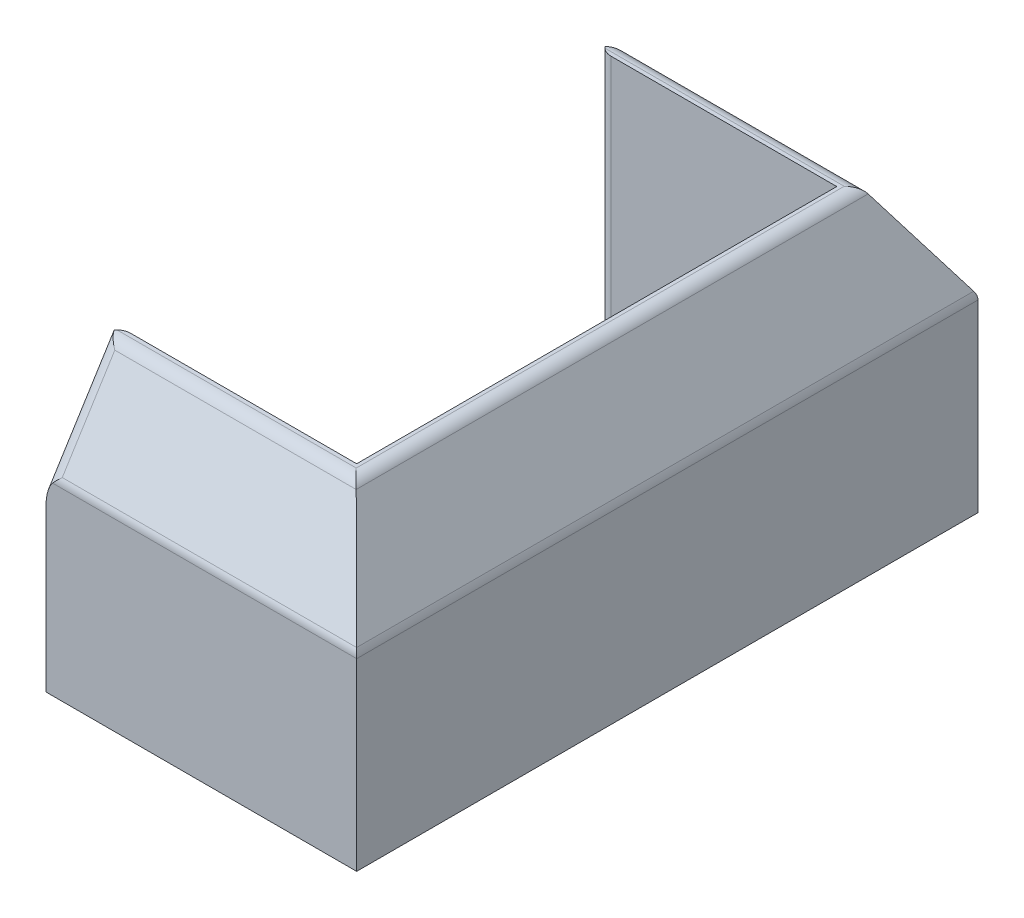
ISO-10303-21;
HEADER;
FILE_DESCRIPTION(('STEP AP214'),'2;1');
FILE_NAME('part.step','',(''),(''),'','','');
FILE_SCHEMA(('AUTOMOTIVE_DESIGN { 1 0 10303 214 1 1 1 1 }'));
ENDSEC;
DATA;
#1=APPLICATION_CONTEXT('core data for automotive mechanical design processes');
#2=APPLICATION_PROTOCOL_DEFINITION('international standard','automotive_design',2000,#1);
#3=PRODUCT_CONTEXT('',#1,'mechanical');
#4=PRODUCT('Part','Part','',(#3));
#5=PRODUCT_RELATED_PRODUCT_CATEGORY('part','',(#4));
#6=PRODUCT_DEFINITION_FORMATION('','',#4);
#7=PRODUCT_DEFINITION_CONTEXT('part definition',#1,'design');
#8=PRODUCT_DEFINITION('design','',#6,#7);
#9=PRODUCT_DEFINITION_SHAPE('','',#8);
#10=(LENGTH_UNIT() NAMED_UNIT(*) SI_UNIT(.MILLI.,.METRE.));
#11=(NAMED_UNIT(*) PLANE_ANGLE_UNIT() SI_UNIT($,.RADIAN.));
#12=(NAMED_UNIT(*) SI_UNIT($,.STERADIAN.) SOLID_ANGLE_UNIT());
#13=UNCERTAINTY_MEASURE_WITH_UNIT(LENGTH_MEASURE(1.E-05),#10,'distance_accuracy_value','');
#14=(GEOMETRIC_REPRESENTATION_CONTEXT(3) GLOBAL_UNCERTAINTY_ASSIGNED_CONTEXT((#13)) GLOBAL_UNIT_ASSIGNED_CONTEXT((#10,
#11,#12)) REPRESENTATION_CONTEXT('',''));
#15=CARTESIAN_POINT('',(0.,0.,0.));
#16=DIRECTION('',(0.,0.,1.));
#17=DIRECTION('',(1.,0.,0.));
#18=AXIS2_PLACEMENT_3D('',#15,#16,#17);
#19=CARTESIAN_POINT('',(-16.764,10.16,0.));
#20=DIRECTION('',(0.,0.,-1.));
#21=DIRECTION('',(-1.,0.,0.));
#22=AXIS2_PLACEMENT_3D('',#19,#20,#21);
#23=PLANE('',#22);
#24=DIRECTION('',(1.,0.,0.));
#25=VECTOR('',#24,1.);
#26=CARTESIAN_POINT('',(-16.764,9.94146127547458,0.));
#27=LINE('',#26,#25);
#28=CARTESIAN_POINT('',(0.,9.94146127547458,0.));
#29=VERTEX_POINT('',#28);
#30=CARTESIAN_POINT('',(-16.4058591922886,9.94146127547458,0.));
#31=VERTEX_POINT('',#30);
#32=EDGE_CURVE('E97',#29,#31,#27,.F.);
#33=ORIENTED_EDGE('',*,*,#32,.T.);
#34=CARTESIAN_POINT('',(-16.002,8.72226127547458,0.));
#35=DIRECTION('',(0.,0.,-1.));
#36=DIRECTION('',(0.,1.,0.));
#37=AXIS2_PLACEMENT_3D('',#34,#35,#36);
#38=ELLIPSE('',#37,1.43773872452543,0.762);
#39=CARTESIAN_POINT('',(-16.764,8.72226127547458,0.));
#40=VERTEX_POINT('',#39);
#41=EDGE_CURVE('E88',#31,#40,#38,.F.);
#42=ORIENTED_EDGE('',*,*,#41,.T.);
#43=DIRECTION('',(0.,-1.,0.));
#44=VECTOR('',#43,1.);
#45=CARTESIAN_POINT('',(-16.764,10.16,0.));
#46=LINE('',#45,#44);
#47=CARTESIAN_POINT('',(-16.764,0.,0.));
#48=VERTEX_POINT('',#47);
#49=EDGE_CURVE('E462',#40,#48,#46,.T.);
#50=ORIENTED_EDGE('',*,*,#49,.T.);
#51=DIRECTION('',(1.,0.,0.));
#52=VECTOR('',#51,1.);
#53=CARTESIAN_POINT('',(-16.764,0.,0.));
#54=LINE('',#53,#52);
#55=CARTESIAN_POINT('',(0.,0.,0.));
#56=VERTEX_POINT('',#55);
#57=EDGE_CURVE('E698',#48,#56,#54,.T.);
#58=ORIENTED_EDGE('',*,*,#57,.T.);
#59=DIRECTION('',(0.,-1.,0.));
#60=VECTOR('',#59,1.);
#61=CARTESIAN_POINT('',(0.,10.16,0.));
#62=LINE('',#61,#60);
#63=CARTESIAN_POINT('',(0.,9.93998127926982,0.));
#64=VERTEX_POINT('',#63);
#65=EDGE_CURVE('E269',#64,#56,#62,.T.);
#66=ORIENTED_EDGE('',*,*,#65,.F.);
#67=EDGE_CURVE('E267',#29,#64,#62,.T.);
#68=ORIENTED_EDGE('',*,*,#67,.F.);
#69=EDGE_LOOP('',(#33,#42,#50,#58,#66,#68));
#70=FACE_BOUND('',#69,.T.);
#71=ADVANCED_FACE('F77',(#70),#23,.F.);
#72=CARTESIAN_POINT('',(0.,10.16,0.));
#73=DIRECTION('',(-1.,0.,0.));
#74=DIRECTION('',(0.,0.,1.));
#75=AXIS2_PLACEMENT_3D('',#72,#73,#74);
#76=PLANE('',#75);
#77=DIRECTION('',(0.,-1.,0.));
#78=VECTOR('',#77,1.);
#79=CARTESIAN_POINT('',(0.,10.16,-33.528));
#80=LINE('',#79,#78);
#81=CARTESIAN_POINT('',(0.,9.93998127926982,-33.528));
#82=VERTEX_POINT('',#81);
#83=CARTESIAN_POINT('',(0.,0.,-33.528));
#84=VERTEX_POINT('',#83);
#85=EDGE_CURVE('E409',#82,#84,#80,.T.);
#86=ORIENTED_EDGE('',*,*,#85,.F.);
#87=DIRECTION('',(0.,0.,-1.));
#88=VECTOR('',#87,1.);
#89=CARTESIAN_POINT('',(0.,9.93998127926982,0.));
#90=LINE('',#89,#88);
#91=EDGE_CURVE('E12',#82,#64,#90,.F.);
#92=ORIENTED_EDGE('',*,*,#91,.T.);
#93=ORIENTED_EDGE('',*,*,#65,.T.);
#94=DIRECTION('',(0.,0.,-1.));
#95=VECTOR('',#94,1.);
#96=CARTESIAN_POINT('',(0.,0.,0.));
#97=LINE('',#96,#95);
#98=EDGE_CURVE('E718',#56,#84,#97,.T.);
#99=ORIENTED_EDGE('',*,*,#98,.T.);
#100=EDGE_LOOP('',(#86,#92,#93,#99));
#101=FACE_BOUND('',#100,.T.);
#102=ADVANCED_FACE('F344',(#101),#76,.F.);
#103=CARTESIAN_POINT('',(-3.81,10.16,-16.764));
#104=DIRECTION('',(1.,0.,0.));
#105=DIRECTION('',(0.,0.,-1.));
#106=AXIS2_PLACEMENT_3D('',#103,#104,#105);
#107=PLANE('',#106);
#108=DIRECTION('',(0.,-1.,0.));
#109=VECTOR('',#108,1.);
#110=CARTESIAN_POINT('',(-3.81,10.16,-11.43));
#111=LINE('',#110,#109);
#112=CARTESIAN_POINT('',(-3.81,2.54,-11.43));
#113=VERTEX_POINT('',#112);
#114=CARTESIAN_POINT('',(-3.81,0.,-11.43));
#115=VERTEX_POINT('',#114);
#116=EDGE_CURVE('E678',#113,#115,#111,.T.);
#117=ORIENTED_EDGE('',*,*,#116,.F.);
#118=DIRECTION('',(0.,0.,1.));
#119=VECTOR('',#118,1.);
#120=CARTESIAN_POINT('',(-3.81,2.54,-16.764));
#121=LINE('',#120,#119);
#122=CARTESIAN_POINT('',(-3.81,2.54,-3.81));
#123=VERTEX_POINT('',#122);
#124=EDGE_CURVE('E680',#113,#123,#121,.T.);
#125=ORIENTED_EDGE('',*,*,#124,.T.);
#126=DIRECTION('',(0.,-1.,0.));
#127=VECTOR('',#126,1.);
#128=CARTESIAN_POINT('',(-3.81,10.16,-3.81));
#129=LINE('',#128,#127);
#130=CARTESIAN_POINT('',(-3.81,15.24,-3.81));
#131=VERTEX_POINT('',#130);
#132=EDGE_CURVE('E734',#131,#123,#129,.T.);
#133=ORIENTED_EDGE('',*,*,#132,.F.);
#134=DIRECTION('',(0.,0.,1.));
#135=VECTOR('',#134,1.);
#136=CARTESIAN_POINT('',(-3.81,15.24,-16.764));
#137=LINE('',#136,#135);
#138=CARTESIAN_POINT('',(-3.81,15.24,-29.718));
#139=VERTEX_POINT('',#138);
#140=EDGE_CURVE('E124',#139,#131,#137,.T.);
#141=ORIENTED_EDGE('',*,*,#140,.F.);
#142=DIRECTION('',(0.,-1.,0.));
#143=VECTOR('',#142,1.);
#144=CARTESIAN_POINT('',(-3.81,10.16,-29.718));
#145=LINE('',#144,#143);
#146=CARTESIAN_POINT('',(-3.81,2.54,-29.718));
#147=VERTEX_POINT('',#146);
#148=EDGE_CURVE('E416',#139,#147,#145,.T.);
#149=ORIENTED_EDGE('',*,*,#148,.T.);
#150=DIRECTION('',(0.,0.,-1.));
#151=VECTOR('',#150,1.);
#152=CARTESIAN_POINT('',(-3.81,2.54,-16.764));
#153=LINE('',#152,#151);
#154=CARTESIAN_POINT('',(-3.81,2.54,-22.098));
#155=VERTEX_POINT('',#154);
#156=EDGE_CURVE('E617',#155,#147,#153,.T.);
#157=ORIENTED_EDGE('',*,*,#156,.F.);
#158=DIRECTION('',(0.,-1.,0.));
#159=VECTOR('',#158,1.);
#160=CARTESIAN_POINT('',(-3.81,10.16,-22.098));
#161=LINE('',#160,#159);
#162=CARTESIAN_POINT('',(-3.81,0.,-22.098));
#163=VERTEX_POINT('',#162);
#164=EDGE_CURVE('E623',#155,#163,#161,.T.);
#165=ORIENTED_EDGE('',*,*,#164,.T.);
#166=DIRECTION('',(0.,0.,1.));
#167=VECTOR('',#166,1.);
#168=CARTESIAN_POINT('',(-3.81,0.,-16.764));
#169=LINE('',#168,#167);
#170=EDGE_CURVE('E683',#163,#115,#169,.T.);
#171=ORIENTED_EDGE('',*,*,#170,.T.);
#172=EDGE_LOOP('',(#117,#125,#133,#141,#149,#157,#165,#171));
#173=FACE_BOUND('',#172,.T.);
#174=ADVANCED_FACE('F350',(#173),#107,.F.);
#175=CARTESIAN_POINT('',(-3.81,10.16,-3.81));
#176=DIRECTION('',(0.,0.,1.));
#177=DIRECTION('',(1.,0.,0.));
#178=AXIS2_PLACEMENT_3D('',#175,#176,#177);
#179=PLANE('',#178);
#180=DIRECTION('',(-1.,0.,0.));
#181=VECTOR('',#180,1.);
#182=CARTESIAN_POINT('',(-3.81,0.,-3.81));
#183=LINE('',#182,#181);
#184=CARTESIAN_POINT('',(-11.43,0.,-3.81));
#185=VERTEX_POINT('',#184);
#186=CARTESIAN_POINT('',(-16.002,0.,-3.81));
#187=VERTEX_POINT('',#186);
#188=EDGE_CURVE('E724',#185,#187,#183,.T.);
#189=ORIENTED_EDGE('',*,*,#188,.T.);
#190=DIRECTION('',(0.,-1.,0.));
#191=VECTOR('',#190,1.);
#192=CARTESIAN_POINT('',(-16.002,10.16,-3.81));
#193=LINE('',#192,#191);
#194=CARTESIAN_POINT('',(-16.002,15.24,-3.81));
#195=VERTEX_POINT('',#194);
#196=EDGE_CURVE('E550',#187,#195,#193,.F.);
#197=ORIENTED_EDGE('',*,*,#196,.T.);
#198=DIRECTION('',(-1.,0.,0.));
#199=VECTOR('',#198,1.);
#200=CARTESIAN_POINT('',(-3.81,15.24,-3.81));
#201=LINE('',#200,#199);
#202=EDGE_CURVE('E414',#131,#195,#201,.T.);
#203=ORIENTED_EDGE('',*,*,#202,.F.);
#204=ORIENTED_EDGE('',*,*,#132,.T.);
#205=DIRECTION('',(-1.,0.,0.));
#206=VECTOR('',#205,1.);
#207=CARTESIAN_POINT('',(-3.81,2.54,-3.81));
#208=LINE('',#207,#206);
#209=CARTESIAN_POINT('',(-11.43,2.54,-3.81));
#210=VERTEX_POINT('',#209);
#211=EDGE_CURVE('E274',#123,#210,#208,.T.);
#212=ORIENTED_EDGE('',*,*,#211,.T.);
#213=DIRECTION('',(0.,1.,0.));
#214=VECTOR('',#213,1.);
#215=CARTESIAN_POINT('',(-11.43,10.16,-3.81));
#216=LINE('',#215,#214);
#217=EDGE_CURVE('E689',#185,#210,#216,.T.);
#218=ORIENTED_EDGE('',*,*,#217,.F.);
#219=EDGE_LOOP('',(#189,#197,#203,#204,#212,#218));
#220=FACE_BOUND('',#219,.T.);
#221=ADVANCED_FACE('F665',(#220),#179,.F.);
#222=CARTESIAN_POINT('',(-16.764,10.16,-3.81));
#223=DIRECTION('',(1.,0.,0.));
#224=DIRECTION('',(0.,0.,-1.));
#225=AXIS2_PLACEMENT_3D('',#222,#223,#224);
#226=PLANE('',#225);
#227=DIRECTION('',(0.,0.847998304005088,-0.52999894000318));
#228=VECTOR('',#227,1.);
#229=CARTESIAN_POINT('',(-16.764,11.4685003582794,-1.716399426753));
#230=LINE('',#229,#228);
#231=CARTESIAN_POINT('',(-16.764,13.5990612754746,-3.048));
#232=VERTEX_POINT('',#231);
#233=EDGE_CURVE('E544',#40,#232,#230,.T.);
#234=ORIENTED_EDGE('',*,*,#233,.T.);
#235=DIRECTION('',(0.,-1.,0.));
#236=VECTOR('',#235,1.);
#237=CARTESIAN_POINT('',(-16.764,10.16,-3.048));
#238=LINE('',#237,#236);
#239=CARTESIAN_POINT('',(-16.764,0.,-3.048));
#240=VERTEX_POINT('',#239);
#241=EDGE_CURVE('E547',#232,#240,#238,.T.);
#242=ORIENTED_EDGE('',*,*,#241,.T.);
#243=DIRECTION('',(0.,0.,1.));
#244=VECTOR('',#243,1.);
#245=CARTESIAN_POINT('',(-16.764,0.,-3.81));
#246=LINE('',#245,#244);
#247=EDGE_CURVE('E728',#240,#48,#246,.T.);
#248=ORIENTED_EDGE('',*,*,#247,.T.);
#249=ORIENTED_EDGE('',*,*,#49,.F.);
#250=EDGE_LOOP('',(#234,#242,#248,#249));
#251=FACE_BOUND('',#250,.T.);
#252=ADVANCED_FACE('F656',(#251),#226,.F.);
#253=CARTESIAN_POINT('',(0.,0.,0.));
#254=DIRECTION('',(0.,1.,0.));
#255=DIRECTION('',(0.,0.,1.));
#256=AXIS2_PLACEMENT_3D('',#253,#254,#255);
#257=PLANE('',#256);
#258=DIRECTION('',(-1.,0.,0.));
#259=VECTOR('',#258,1.);
#260=CARTESIAN_POINT('',(0.,0.,-22.098));
#261=LINE('',#260,#259);
#262=CARTESIAN_POINT('',(-10.668,0.,-22.098));
#263=VERTEX_POINT('',#262);
#264=EDGE_CURVE('E634',#163,#263,#261,.T.);
#265=ORIENTED_EDGE('',*,*,#264,.T.);
#266=CARTESIAN_POINT('',(-10.668,0.,-22.86));
#267=DIRECTION('',(0.,1.,0.));
#268=DIRECTION('',(0.,0.,1.));
#269=AXIS2_PLACEMENT_3D('',#266,#267,#268);
#270=CIRCLE('',#269,0.762);
#271=CARTESIAN_POINT('',(-11.43,0.,-22.86));
#272=VERTEX_POINT('',#271);
#273=EDGE_CURVE('E480',#263,#272,#270,.F.);
#274=ORIENTED_EDGE('',*,*,#273,.T.);
#275=DIRECTION('',(0.,0.,-1.));
#276=VECTOR('',#275,1.);
#277=CARTESIAN_POINT('',(-11.43,0.,-33.528));
#278=LINE('',#277,#276);
#279=CARTESIAN_POINT('',(-11.43,0.,-29.718));
#280=VERTEX_POINT('',#279);
#281=EDGE_CURVE('E608',#272,#280,#278,.T.);
#282=ORIENTED_EDGE('',*,*,#281,.T.);
#283=DIRECTION('',(-1.,0.,0.));
#284=VECTOR('',#283,1.);
#285=CARTESIAN_POINT('',(-3.81,0.,-29.718));
#286=LINE('',#285,#284);
#287=CARTESIAN_POINT('',(-16.002,0.,-29.718));
#288=VERTEX_POINT('',#287);
#289=EDGE_CURVE('E598',#280,#288,#286,.T.);
#290=ORIENTED_EDGE('',*,*,#289,.T.);
#291=CARTESIAN_POINT('',(-16.002,0.,-30.48));
#292=DIRECTION('',(0.,1.,0.));
#293=DIRECTION('',(0.,0.,1.));
#294=AXIS2_PLACEMENT_3D('',#291,#292,#293);
#295=CIRCLE('',#294,0.762);
#296=CARTESIAN_POINT('',(-16.764,0.,-30.48));
#297=VERTEX_POINT('',#296);
#298=EDGE_CURVE('E477',#288,#297,#295,.F.);
#299=ORIENTED_EDGE('',*,*,#298,.T.);
#300=DIRECTION('',(0.,0.,-1.));
#301=VECTOR('',#300,1.);
#302=CARTESIAN_POINT('',(-16.764,0.,-29.718));
#303=LINE('',#302,#301);
#304=CARTESIAN_POINT('',(-16.764,0.,-33.528));
#305=VERTEX_POINT('',#304);
#306=EDGE_CURVE('E423',#297,#305,#303,.T.);
#307=ORIENTED_EDGE('',*,*,#306,.T.);
#308=DIRECTION('',(1.,0.,0.));
#309=VECTOR('',#308,1.);
#310=CARTESIAN_POINT('',(-16.764,0.,-33.528));
#311=LINE('',#310,#309);
#312=EDGE_CURVE('E611',#305,#84,#311,.T.);
#313=ORIENTED_EDGE('',*,*,#312,.T.);
#314=ORIENTED_EDGE('',*,*,#98,.F.);
#315=ORIENTED_EDGE('',*,*,#57,.F.);
#316=ORIENTED_EDGE('',*,*,#247,.F.);
#317=CARTESIAN_POINT('',(-16.002,0.,-3.048));
#318=DIRECTION('',(0.,1.,0.));
#319=DIRECTION('',(0.,0.,1.));
#320=AXIS2_PLACEMENT_3D('',#317,#318,#319);
#321=CIRCLE('',#320,0.762);
#322=EDGE_CURVE('E471',#240,#187,#321,.F.);
#323=ORIENTED_EDGE('',*,*,#322,.T.);
#324=ORIENTED_EDGE('',*,*,#188,.F.);
#325=DIRECTION('',(0.,0.,1.));
#326=VECTOR('',#325,1.);
#327=CARTESIAN_POINT('',(-11.43,0.,0.));
#328=LINE('',#327,#326);
#329=CARTESIAN_POINT('',(-11.43,0.,-10.668));
#330=VERTEX_POINT('',#329);
#331=EDGE_CURVE('E703',#330,#185,#328,.T.);
#332=ORIENTED_EDGE('',*,*,#331,.F.);
#333=CARTESIAN_POINT('',(-10.668,0.,-10.668));
#334=DIRECTION('',(0.,1.,0.));
#335=DIRECTION('',(0.,0.,1.));
#336=AXIS2_PLACEMENT_3D('',#333,#334,#335);
#337=CIRCLE('',#336,0.762);
#338=CARTESIAN_POINT('',(-10.668,0.,-11.43));
#339=VERTEX_POINT('',#338);
#340=EDGE_CURVE('E474',#330,#339,#337,.F.);
#341=ORIENTED_EDGE('',*,*,#340,.T.);
#342=DIRECTION('',(-1.,0.,0.));
#343=VECTOR('',#342,1.);
#344=CARTESIAN_POINT('',(0.,0.,-11.43));
#345=LINE('',#344,#343);
#346=EDGE_CURVE('E708',#115,#339,#345,.T.);
#347=ORIENTED_EDGE('',*,*,#346,.F.);
#348=ORIENTED_EDGE('',*,*,#170,.F.);
#349=EDGE_LOOP('',(#265,#274,#282,#290,#299,#307,#313,#314,#315,#316,#323,#324,#332,#341,#347,#348));
#350=FACE_BOUND('',#349,.T.);
#351=CARTESIAN_POINT('',(-7.874,0.,-7.874));
#352=DIRECTION('',(0.,1.,0.));
#353=DIRECTION('',(0.,0.,1.));
#354=AXIS2_PLACEMENT_3D('',#351,#352,#353);
#355=CIRCLE('',#354,2.);
#356=CARTESIAN_POINT('',(-7.874,0.,-5.874));
#357=VERTEX_POINT('',#356);
#358=EDGE_CURVE('E442',#357,#357,#355,.T.);
#359=ORIENTED_EDGE('',*,*,#358,.T.);
#360=EDGE_LOOP('',(#359));
#361=FACE_BOUND('',#360,.T.);
#362=CARTESIAN_POINT('',(-7.874,0.,-25.654));
#363=DIRECTION('',(0.,-1.,0.));
#364=DIRECTION('',(0.,0.,-1.));
#365=AXIS2_PLACEMENT_3D('',#362,#363,#364);
#366=CIRCLE('',#365,2.);
#367=CARTESIAN_POINT('',(-7.874,0.,-27.654));
#368=VERTEX_POINT('',#367);
#369=EDGE_CURVE('E575',#368,#368,#366,.T.);
#370=ORIENTED_EDGE('',*,*,#369,.F.);
#371=EDGE_LOOP('',(#370));
#372=FACE_BOUND('',#371,.T.);
#373=ADVANCED_FACE('F603',(#350,#361,#372),#257,.F.);
#374=CARTESIAN_POINT('',(0.,2.54,0.));
#375=DIRECTION('',(0.,1.,0.));
#376=DIRECTION('',(0.,0.,1.));
#377=AXIS2_PLACEMENT_3D('',#374,#375,#376);
#378=PLANE('',#377);
#379=CARTESIAN_POINT('',(-7.874,2.54,-7.874));
#380=DIRECTION('',(0.,1.,0.));
#381=DIRECTION('',(0.,0.,1.));
#382=AXIS2_PLACEMENT_3D('',#379,#380,#381);
#383=CIRCLE('',#382,2.);
#384=CARTESIAN_POINT('',(-7.874,2.54,-5.874));
#385=VERTEX_POINT('',#384);
#386=EDGE_CURVE('E431',#385,#385,#383,.T.);
#387=ORIENTED_EDGE('',*,*,#386,.F.);
#388=EDGE_LOOP('',(#387));
#389=FACE_BOUND('',#388,.T.);
#390=DIRECTION('',(-1.,0.,0.));
#391=VECTOR('',#390,1.);
#392=CARTESIAN_POINT('',(0.,2.54,-11.43));
#393=LINE('',#392,#391);
#394=CARTESIAN_POINT('',(-10.668,2.54,-11.43));
#395=VERTEX_POINT('',#394);
#396=EDGE_CURVE('E694',#113,#395,#393,.T.);
#397=ORIENTED_EDGE('',*,*,#396,.T.);
#398=CARTESIAN_POINT('',(-10.668,2.54,-10.668));
#399=DIRECTION('',(0.,1.,0.));
#400=DIRECTION('',(0.,0.,1.));
#401=AXIS2_PLACEMENT_3D('',#398,#399,#400);
#402=CIRCLE('',#401,0.762);
#403=CARTESIAN_POINT('',(-11.43,2.54,-10.668));
#404=VERTEX_POINT('',#403);
#405=EDGE_CURVE('E541',#395,#404,#402,.T.);
#406=ORIENTED_EDGE('',*,*,#405,.T.);
#407=DIRECTION('',(0.,0.,1.));
#408=VECTOR('',#407,1.);
#409=CARTESIAN_POINT('',(-11.43,2.54,0.));
#410=LINE('',#409,#408);
#411=EDGE_CURVE('E702',#404,#210,#410,.T.);
#412=ORIENTED_EDGE('',*,*,#411,.T.);
#413=ORIENTED_EDGE('',*,*,#211,.F.);
#414=ORIENTED_EDGE('',*,*,#124,.F.);
#415=EDGE_LOOP('',(#397,#406,#412,#413,#414));
#416=FACE_BOUND('',#415,.T.);
#417=ADVANCED_FACE('F655',(#389,#416),#378,.T.);
#418=CARTESIAN_POINT('',(0.,2.54,-11.43));
#419=DIRECTION('',(0.,0.,1.));
#420=DIRECTION('',(1.,0.,0.));
#421=AXIS2_PLACEMENT_3D('',#418,#419,#420);
#422=PLANE('',#421);
#423=ORIENTED_EDGE('',*,*,#346,.T.);
#424=DIRECTION('',(0.,-1.,0.));
#425=VECTOR('',#424,1.);
#426=CARTESIAN_POINT('',(-10.668,2.54,-11.43));
#427=LINE('',#426,#425);
#428=EDGE_CURVE('E538',#339,#395,#427,.F.);
#429=ORIENTED_EDGE('',*,*,#428,.T.);
#430=ORIENTED_EDGE('',*,*,#396,.F.);
#431=ORIENTED_EDGE('',*,*,#116,.T.);
#432=EDGE_LOOP('',(#423,#429,#430,#431));
#433=FACE_BOUND('',#432,.T.);
#434=ADVANCED_FACE('F662',(#433),#422,.F.);
#435=CARTESIAN_POINT('',(-11.43,2.54,0.));
#436=DIRECTION('',(1.,0.,0.));
#437=DIRECTION('',(0.,0.,-1.));
#438=AXIS2_PLACEMENT_3D('',#435,#436,#437);
#439=PLANE('',#438);
#440=ORIENTED_EDGE('',*,*,#411,.F.);
#441=DIRECTION('',(0.,-1.,0.));
#442=VECTOR('',#441,1.);
#443=CARTESIAN_POINT('',(-11.43,2.54,-10.668));
#444=LINE('',#443,#442);
#445=EDGE_CURVE('E532',#404,#330,#444,.T.);
#446=ORIENTED_EDGE('',*,*,#445,.T.);
#447=ORIENTED_EDGE('',*,*,#331,.T.);
#448=ORIENTED_EDGE('',*,*,#217,.T.);
#449=EDGE_LOOP('',(#440,#446,#447,#448));
#450=FACE_BOUND('',#449,.T.);
#451=ADVANCED_FACE('F769',(#450),#439,.F.);
#452=CARTESIAN_POINT('',(-7.874,2.54,-7.874));
#453=DIRECTION('',(0.,-1.,0.));
#454=DIRECTION('',(0.,0.,-1.));
#455=AXIS2_PLACEMENT_3D('',#452,#453,#454);
#456=CYLINDRICAL_SURFACE('',#455,2.);
#457=ORIENTED_EDGE('',*,*,#386,.T.);
#458=EDGE_LOOP('',(#457));
#459=FACE_BOUND('',#458,.T.);
#460=ORIENTED_EDGE('',*,*,#358,.F.);
#461=EDGE_LOOP('',(#460));
#462=FACE_BOUND('',#461,.T.);
#463=ADVANCED_FACE('F792',(#459,#462),#456,.F.);
#464=CARTESIAN_POINT('',(0.,15.24,0.));
#465=DIRECTION('',(0.,-1.,0.));
#466=DIRECTION('',(0.,0.,-1.));
#467=AXIS2_PLACEMENT_3D('',#464,#465,#466);
#468=PLANE('',#467);
#469=DIRECTION('',(1.,0.,0.));
#470=VECTOR('',#469,1.);
#471=CARTESIAN_POINT('',(0.,15.24,-29.9306632971716));
#472=LINE('',#471,#470);
#473=CARTESIAN_POINT('',(-3.62095179406001,15.24,-29.9306632971716));
#474=VERTEX_POINT('',#473);
#475=CARTESIAN_POINT('',(-16.5300844505623,15.24,-29.9306632971716));
#476=VERTEX_POINT('',#475);
#477=EDGE_CURVE('E521',#474,#476,#472,.F.);
#478=ORIENTED_EDGE('',*,*,#477,.T.);
#479=CARTESIAN_POINT('',(-16.002,15.24,-30.48));
#480=DIRECTION('',(0.,-1.,0.));
#481=DIRECTION('',(0.,0.,-1.));
#482=AXIS2_PLACEMENT_3D('',#479,#480,#481);
#483=CIRCLE('',#482,0.762);
#484=CARTESIAN_POINT('',(-16.002,15.24,-29.718));
#485=VERTEX_POINT('',#484);
#486=EDGE_CURVE('E444',#476,#485,#483,.F.);
#487=ORIENTED_EDGE('',*,*,#486,.T.);
#488=DIRECTION('',(1.,0.,0.));
#489=VECTOR('',#488,1.);
#490=CARTESIAN_POINT('',(-3.81,15.24,-29.718));
#491=LINE('',#490,#489);
#492=EDGE_CURVE('E424',#139,#485,#491,.F.);
#493=ORIENTED_EDGE('',*,*,#492,.F.);
#494=ORIENTED_EDGE('',*,*,#140,.T.);
#495=ORIENTED_EDGE('',*,*,#202,.T.);
#496=CARTESIAN_POINT('',(-16.002,15.24,-3.048));
#497=DIRECTION('',(0.,-1.,0.));
#498=DIRECTION('',(0.,0.,-1.));
#499=AXIS2_PLACEMENT_3D('',#496,#497,#498);
#500=CIRCLE('',#499,0.762);
#501=CARTESIAN_POINT('',(-16.5300844505623,15.24,-3.59733670282839));
#502=VERTEX_POINT('',#501);
#503=EDGE_CURVE('E519',#195,#502,#500,.F.);
#504=ORIENTED_EDGE('',*,*,#503,.T.);
#505=DIRECTION('',(1.,0.,0.));
#506=VECTOR('',#505,1.);
#507=CARTESIAN_POINT('',(0.,15.24,-3.59733670282839));
#508=LINE('',#507,#506);
#509=CARTESIAN_POINT('',(-3.62095179406001,15.24,-3.59733670282839));
#510=VERTEX_POINT('',#509);
#511=EDGE_CURVE('E513',#502,#510,#508,.T.);
#512=ORIENTED_EDGE('',*,*,#511,.T.);
#513=DIRECTION('',(0.,0.,-1.));
#514=VECTOR('',#513,1.);
#515=CARTESIAN_POINT('',(-3.62095179406001,15.24,0.));
#516=LINE('',#515,#514);
#517=EDGE_CURVE('E516',#510,#474,#516,.T.);
#518=ORIENTED_EDGE('',*,*,#517,.T.);
#519=EDGE_LOOP('',(#478,#487,#493,#494,#495,#504,#512,#518));
#520=FACE_BOUND('',#519,.T.);
#521=ADVANCED_FACE('F775',(#520),#468,.F.);
#522=CARTESIAN_POINT('',(0.,2.85393258426967,4.56629213483146));
#523=DIRECTION('',(0.,-0.52999894000318,-0.847998304005088));
#524=DIRECTION('',(0.,0.847998304005088,-0.52999894000318));
#525=AXIS2_PLACEMENT_3D('',#522,#523,#524);
#526=PLANE('',#525);
#527=DIRECTION('',(-0.471209987801044,0.747952361588959,-0.467470225993099));
#528=VECTOR('',#527,1.);
#529=CARTESIAN_POINT('',(0.,10.16,0.));
#530=LINE('',#529,#528);
#531=CARTESIAN_POINT('',(-0.117278263254339,10.3461559734196,-0.116347483387241));
#532=VERTEX_POINT('',#531);
#533=CARTESIAN_POINT('',(-2.97477129113793,14.8818591922824,-2.95116199517651));
#534=VERTEX_POINT('',#533);
#535=EDGE_CURVE('E443',#532,#534,#530,.T.);
#536=ORIENTED_EDGE('',*,*,#535,.T.);
#537=DIRECTION('',(1.,0.,0.));
#538=VECTOR('',#537,1.);
#539=CARTESIAN_POINT('',(0.,14.8818591922824,-2.95116199517651));
#540=LINE('',#539,#538);
#541=CARTESIAN_POINT('',(-16.002,14.8818591922824,-2.95116199517651));
#542=VERTEX_POINT('',#541);
#543=EDGE_CURVE('E286',#534,#542,#540,.F.);
#544=ORIENTED_EDGE('',*,*,#543,.T.);
#545=DIRECTION('',(0.,0.847998304005088,-0.52999894000318));
#546=VECTOR('',#545,1.);
#547=CARTESIAN_POINT('',(-16.002,2.85393258426967,4.56629213483146));
#548=LINE('',#547,#546);
#549=CARTESIAN_POINT('',(-16.002,10.345320467757,-0.115825292348123));
#550=VERTEX_POINT('',#549);
#551=EDGE_CURVE('E556',#542,#550,#548,.F.);
#552=ORIENTED_EDGE('',*,*,#551,.T.);
#553=DIRECTION('',(1.,0.,0.));
#554=VECTOR('',#553,1.);
#555=CARTESIAN_POINT('',(0.,10.345320467757,-0.115825292348123));
#556=LINE('',#555,#554);
#557=CARTESIAN_POINT('',(-0.116751894686909,10.345320467757,-0.115825292348124));
#558=VERTEX_POINT('',#557);
#559=EDGE_CURVE('E553',#550,#558,#556,.T.);
#560=ORIENTED_EDGE('',*,*,#559,.T.);
#561=EDGE_CURVE('E291',#558,#532,#530,.T.);
#562=ORIENTED_EDGE('',*,*,#561,.T.);
#563=EDGE_LOOP('',(#536,#544,#552,#560,#562));
#564=FACE_BOUND('',#563,.T.);
#565=ADVANCED_FACE('F779',(#564),#526,.F.);
#566=CARTESIAN_POINT('',(4.58214618082898,2.88675209392226,0.));
#567=DIRECTION('',(-0.846091518038927,-0.533037656364524,0.));
#568=DIRECTION('',(0.533037656364524,-0.846091518038927,0.));
#569=AXIS2_PLACEMENT_3D('',#566,#567,#568);
#570=PLANE('',#569);
#571=DIRECTION('',(-0.471209987801044,0.747952361588959,0.467470225993099));
#572=VECTOR('',#571,1.);
#573=CARTESIAN_POINT('',(0.,10.16,-33.528));
#574=LINE('',#573,#572);
#575=CARTESIAN_POINT('',(-2.97477129113792,14.8818591922824,-30.5768380048235));
#576=VERTEX_POINT('',#575);
#577=CARTESIAN_POINT('',(-2.97623005731435,14.8841746941498,-30.5753908161564));
#578=VERTEX_POINT('',#577);
#579=EDGE_CURVE('E428',#576,#578,#574,.T.);
#580=ORIENTED_EDGE('',*,*,#579,.T.);
#581=DIRECTION('',(0.,0.,-1.));
#582=VECTOR('',#581,1.);
#583=CARTESIAN_POINT('',(-2.97623005731435,14.8841746941498,0.));
#584=LINE('',#583,#582);
#585=CARTESIAN_POINT('',(-2.97623005731435,14.8841746941498,-2.9526091838436));
#586=VERTEX_POINT('',#585);
#587=EDGE_CURVE('E527',#578,#586,#584,.F.);
#588=ORIENTED_EDGE('',*,*,#587,.T.);
#589=EDGE_CURVE('E436',#534,#586,#530,.T.);
#590=ORIENTED_EDGE('',*,*,#589,.F.);
#591=ORIENTED_EDGE('',*,*,#535,.F.);
#592=DIRECTION('',(0.,0.,-1.));
#593=VECTOR('',#592,1.);
#594=CARTESIAN_POINT('',(-0.117278263254339,10.3461559734196,0.));
#595=LINE('',#594,#593);
#596=CARTESIAN_POINT('',(-0.117278263254339,10.3461559734196,-33.4116525166128));
#597=VERTEX_POINT('',#596);
#598=EDGE_CURVE('E525',#532,#597,#595,.T.);
#599=ORIENTED_EDGE('',*,*,#598,.T.);
#600=EDGE_CURVE('E573',#597,#576,#574,.T.);
#601=ORIENTED_EDGE('',*,*,#600,.T.);
#602=EDGE_LOOP('',(#580,#588,#590,#591,#599,#601));
#603=FACE_BOUND('',#602,.T.);
#604=ADVANCED_FACE('F586',(#603),#570,.F.);
#605=CARTESIAN_POINT('',(-16.764,10.16,-33.528));
#606=DIRECTION('',(0.,0.,1.));
#607=DIRECTION('',(-1.,0.,0.));
#608=AXIS2_PLACEMENT_3D('',#605,#606,#607);
#609=PLANE('',#608);
#610=DIRECTION('',(0.,-1.,0.));
#611=VECTOR('',#610,1.);
#612=CARTESIAN_POINT('',(-16.764,10.16,-33.528));
#613=LINE('',#612,#611);
#614=CARTESIAN_POINT('',(-16.764,8.72226127547458,-33.528));
#615=VERTEX_POINT('',#614);
#616=EDGE_CURVE('E419',#615,#305,#613,.T.);
#617=ORIENTED_EDGE('',*,*,#616,.F.);
#618=CARTESIAN_POINT('',(-16.002,8.72226127547459,-33.528));
#619=DIRECTION('',(0.,0.,1.));
#620=DIRECTION('',(0.,1.,0.));
#621=AXIS2_PLACEMENT_3D('',#618,#619,#620);
#622=ELLIPSE('',#621,1.43773872452543,0.762);
#623=CARTESIAN_POINT('',(-16.4058591922886,9.94146127547459,-33.528));
#624=VERTEX_POINT('',#623);
#625=EDGE_CURVE('E507',#615,#624,#622,.F.);
#626=ORIENTED_EDGE('',*,*,#625,.T.);
#627=DIRECTION('',(1.,0.,0.));
#628=VECTOR('',#627,1.);
#629=CARTESIAN_POINT('',(-16.764,9.94146127547459,-33.528));
#630=LINE('',#629,#628);
#631=CARTESIAN_POINT('',(0.,9.94146127547458,-33.528));
#632=VERTEX_POINT('',#631);
#633=EDGE_CURVE('E397',#624,#632,#630,.T.);
#634=ORIENTED_EDGE('',*,*,#633,.T.);
#635=EDGE_CURVE('E404',#632,#82,#80,.T.);
#636=ORIENTED_EDGE('',*,*,#635,.T.);
#637=ORIENTED_EDGE('',*,*,#85,.T.);
#638=ORIENTED_EDGE('',*,*,#312,.F.);
#639=EDGE_LOOP('',(#617,#626,#634,#636,#637,#638));
#640=FACE_BOUND('',#639,.T.);
#641=ADVANCED_FACE('F747',(#640),#609,.F.);
#642=CARTESIAN_POINT('',(-3.81,10.16,-29.718));
#643=DIRECTION('',(0.,0.,-1.));
#644=DIRECTION('',(1.,0.,0.));
#645=AXIS2_PLACEMENT_3D('',#642,#643,#644);
#646=PLANE('',#645);
#647=ORIENTED_EDGE('',*,*,#492,.T.);
#648=DIRECTION('',(0.,-1.,0.));
#649=VECTOR('',#648,1.);
#650=CARTESIAN_POINT('',(-16.002,10.16,-29.718));
#651=LINE('',#650,#649);
#652=EDGE_CURVE('E510',#485,#288,#651,.T.);
#653=ORIENTED_EDGE('',*,*,#652,.T.);
#654=ORIENTED_EDGE('',*,*,#289,.F.);
#655=DIRECTION('',(0.,1.,0.));
#656=VECTOR('',#655,1.);
#657=CARTESIAN_POINT('',(-11.43,10.16,-29.718));
#658=LINE('',#657,#656);
#659=CARTESIAN_POINT('',(-11.43,2.54,-29.718));
#660=VERTEX_POINT('',#659);
#661=EDGE_CURVE('E627',#280,#660,#658,.T.);
#662=ORIENTED_EDGE('',*,*,#661,.T.);
#663=DIRECTION('',(-1.,0.,0.));
#664=VECTOR('',#663,1.);
#665=CARTESIAN_POINT('',(-3.81,2.54,-29.718));
#666=LINE('',#665,#664);
#667=EDGE_CURVE('E408',#147,#660,#666,.T.);
#668=ORIENTED_EDGE('',*,*,#667,.F.);
#669=ORIENTED_EDGE('',*,*,#148,.F.);
#670=EDGE_LOOP('',(#647,#653,#654,#662,#668,#669));
#671=FACE_BOUND('',#670,.T.);
#672=ADVANCED_FACE('F595',(#671),#646,.F.);
#673=CARTESIAN_POINT('',(-16.764,10.16,-29.718));
#674=DIRECTION('',(1.,0.,0.));
#675=DIRECTION('',(0.,0.,1.));
#676=AXIS2_PLACEMENT_3D('',#673,#674,#675);
#677=PLANE('',#676);
#678=DIRECTION('',(0.,-1.,0.));
#679=VECTOR('',#678,1.);
#680=CARTESIAN_POINT('',(-16.764,10.16,-30.48));
#681=LINE('',#680,#679);
#682=CARTESIAN_POINT('',(-16.764,13.5990612754746,-30.48));
#683=VERTEX_POINT('',#682);
#684=EDGE_CURVE('E498',#297,#683,#681,.F.);
#685=ORIENTED_EDGE('',*,*,#684,.T.);
#686=DIRECTION('',(0.,0.847998304005088,0.52999894000318));
#687=VECTOR('',#686,1.);
#688=CARTESIAN_POINT('',(-16.764,11.4685003582794,-31.811600573247));
#689=LINE('',#688,#687);
#690=EDGE_CURVE('E501',#683,#615,#689,.F.);
#691=ORIENTED_EDGE('',*,*,#690,.T.);
#692=ORIENTED_EDGE('',*,*,#616,.T.);
#693=ORIENTED_EDGE('',*,*,#306,.F.);
#694=EDGE_LOOP('',(#685,#691,#692,#693));
#695=FACE_BOUND('',#694,.T.);
#696=ADVANCED_FACE('F870',(#695),#677,.F.);
#697=CARTESIAN_POINT('',(0.,2.54,-33.528));
#698=DIRECTION('',(0.,1.,0.));
#699=DIRECTION('',(0.,0.,-1.));
#700=AXIS2_PLACEMENT_3D('',#697,#698,#699);
#701=PLANE('',#700);
#702=CARTESIAN_POINT('',(-7.874,2.54,-25.654));
#703=DIRECTION('',(0.,-1.,0.));
#704=DIRECTION('',(0.,0.,-1.));
#705=AXIS2_PLACEMENT_3D('',#702,#703,#704);
#706=CIRCLE('',#705,2.);
#707=CARTESIAN_POINT('',(-7.874,2.54,-27.654));
#708=VERTEX_POINT('',#707);
#709=EDGE_CURVE('E580',#708,#708,#706,.T.);
#710=ORIENTED_EDGE('',*,*,#709,.T.);
#711=EDGE_LOOP('',(#710));
#712=FACE_BOUND('',#711,.T.);
#713=DIRECTION('',(0.,0.,-1.));
#714=VECTOR('',#713,1.);
#715=CARTESIAN_POINT('',(-11.43,2.54,-33.528));
#716=LINE('',#715,#714);
#717=CARTESIAN_POINT('',(-11.43,2.54,-22.86));
#718=VERTEX_POINT('',#717);
#719=EDGE_CURVE('E630',#718,#660,#716,.T.);
#720=ORIENTED_EDGE('',*,*,#719,.F.);
#721=CARTESIAN_POINT('',(-10.668,2.54,-22.86));
#722=DIRECTION('',(0.,1.,0.));
#723=DIRECTION('',(0.,0.,1.));
#724=AXIS2_PLACEMENT_3D('',#721,#722,#723);
#725=CIRCLE('',#724,0.762);
#726=CARTESIAN_POINT('',(-10.668,2.54,-22.098));
#727=VERTEX_POINT('',#726);
#728=EDGE_CURVE('E486',#718,#727,#725,.T.);
#729=ORIENTED_EDGE('',*,*,#728,.T.);
#730=DIRECTION('',(-1.,0.,0.));
#731=VECTOR('',#730,1.);
#732=CARTESIAN_POINT('',(0.,2.54,-22.098));
#733=LINE('',#732,#731);
#734=EDGE_CURVE('E633',#155,#727,#733,.T.);
#735=ORIENTED_EDGE('',*,*,#734,.F.);
#736=ORIENTED_EDGE('',*,*,#156,.T.);
#737=ORIENTED_EDGE('',*,*,#667,.T.);
#738=EDGE_LOOP('',(#720,#729,#735,#736,#737));
#739=FACE_BOUND('',#738,.T.);
#740=ADVANCED_FACE('F645',(#712,#739),#701,.T.);
#741=CARTESIAN_POINT('',(0.,2.54,-22.098));
#742=DIRECTION('',(0.,0.,-1.));
#743=DIRECTION('',(1.,0.,0.));
#744=AXIS2_PLACEMENT_3D('',#741,#742,#743);
#745=PLANE('',#744);
#746=ORIENTED_EDGE('',*,*,#734,.T.);
#747=DIRECTION('',(0.,-1.,0.));
#748=VECTOR('',#747,1.);
#749=CARTESIAN_POINT('',(-10.668,2.54,-22.098));
#750=LINE('',#749,#748);
#751=EDGE_CURVE('E467',#727,#263,#750,.T.);
#752=ORIENTED_EDGE('',*,*,#751,.T.);
#753=ORIENTED_EDGE('',*,*,#264,.F.);
#754=ORIENTED_EDGE('',*,*,#164,.F.);
#755=EDGE_LOOP('',(#746,#752,#753,#754));
#756=FACE_BOUND('',#755,.T.);
#757=ADVANCED_FACE('F763',(#756),#745,.F.);
#758=CARTESIAN_POINT('',(-11.43,2.54,-33.528));
#759=DIRECTION('',(1.,0.,0.));
#760=DIRECTION('',(0.,0.,1.));
#761=AXIS2_PLACEMENT_3D('',#758,#759,#760);
#762=PLANE('',#761);
#763=ORIENTED_EDGE('',*,*,#281,.F.);
#764=DIRECTION('',(0.,-1.,0.));
#765=VECTOR('',#764,1.);
#766=CARTESIAN_POINT('',(-11.43,2.54,-22.86));
#767=LINE('',#766,#765);
#768=EDGE_CURVE('E483',#272,#718,#767,.F.);
#769=ORIENTED_EDGE('',*,*,#768,.T.);
#770=ORIENTED_EDGE('',*,*,#719,.T.);
#771=ORIENTED_EDGE('',*,*,#661,.F.);
#772=EDGE_LOOP('',(#763,#769,#770,#771));
#773=FACE_BOUND('',#772,.T.);
#774=ADVANCED_FACE('F650',(#773),#762,.F.);
#775=CARTESIAN_POINT('',(-7.874,2.54,-25.654));
#776=DIRECTION('',(0.,-1.,0.));
#777=DIRECTION('',(0.,0.,1.));
#778=AXIS2_PLACEMENT_3D('',#775,#776,#777);
#779=CYLINDRICAL_SURFACE('',#778,2.);
#780=ORIENTED_EDGE('',*,*,#709,.F.);
#781=EDGE_LOOP('',(#780));
#782=FACE_BOUND('',#781,.T.);
#783=ORIENTED_EDGE('',*,*,#369,.T.);
#784=EDGE_LOOP('',(#783));
#785=FACE_BOUND('',#784,.T.);
#786=ADVANCED_FACE('F648',(#782,#785),#779,.F.);
#787=CARTESIAN_POINT('',(0.,2.85393258426967,-38.0942921348315));
#788=DIRECTION('',(0.,-0.52999894000318,0.847998304005088));
#789=DIRECTION('',(0.,0.847998304005088,0.52999894000318));
#790=AXIS2_PLACEMENT_3D('',#787,#788,#789);
#791=PLANE('',#790);
#792=CARTESIAN_POINT('',(-0.116751894686913,10.345320467757,-33.4121747076519));
#793=VERTEX_POINT('',#792);
#794=EDGE_CURVE('E402',#793,#597,#574,.T.);
#795=ORIENTED_EDGE('',*,*,#794,.F.);
#796=DIRECTION('',(1.,0.,0.));
#797=VECTOR('',#796,1.);
#798=CARTESIAN_POINT('',(0.,10.345320467757,-33.4121747076519));
#799=LINE('',#798,#797);
#800=CARTESIAN_POINT('',(-16.002,10.345320467757,-33.4121747076519));
#801=VERTEX_POINT('',#800);
#802=EDGE_CURVE('E399',#793,#801,#799,.F.);
#803=ORIENTED_EDGE('',*,*,#802,.T.);
#804=DIRECTION('',(0.,0.847998304005088,0.52999894000318));
#805=VECTOR('',#804,1.);
#806=CARTESIAN_POINT('',(-16.002,2.85393258426967,-38.0942921348315));
#807=LINE('',#806,#805);
#808=CARTESIAN_POINT('',(-16.002,14.8818591922824,-30.5768380048235));
#809=VERTEX_POINT('',#808);
#810=EDGE_CURVE('E492',#801,#809,#807,.T.);
#811=ORIENTED_EDGE('',*,*,#810,.T.);
#812=DIRECTION('',(1.,0.,0.));
#813=VECTOR('',#812,1.);
#814=CARTESIAN_POINT('',(0.,14.8818591922824,-30.5768380048235));
#815=LINE('',#814,#813);
#816=EDGE_CURVE('E489',#809,#576,#815,.T.);
#817=ORIENTED_EDGE('',*,*,#816,.T.);
#818=ORIENTED_EDGE('',*,*,#600,.F.);
#819=EDGE_LOOP('',(#795,#803,#811,#817,#818));
#820=FACE_BOUND('',#819,.T.);
#821=ADVANCED_FACE('F340',(#820),#791,.F.);
#822=CARTESIAN_POINT('',(-10.668,2.54,-22.86));
#823=DIRECTION('',(0.,-1.,0.));
#824=DIRECTION('',(0.,0.,-1.));
#825=AXIS2_PLACEMENT_3D('',#822,#823,#824);
#826=CYLINDRICAL_SURFACE('',#825,0.762);
#827=ORIENTED_EDGE('',*,*,#728,.F.);
#828=ORIENTED_EDGE('',*,*,#768,.F.);
#829=ORIENTED_EDGE('',*,*,#273,.F.);
#830=ORIENTED_EDGE('',*,*,#751,.F.);
#831=EDGE_LOOP('',(#827,#828,#829,#830));
#832=FACE_BOUND('',#831,.T.);
#833=ADVANCED_FACE('F335',(#832),#826,.T.);
#834=CARTESIAN_POINT('',(-16.002,11.4685003582794,-1.716399426753));
#835=DIRECTION('',(0.,0.847998304005088,-0.52999894000318));
#836=DIRECTION('',(0.,0.52999894000318,0.847998304005088));
#837=AXIS2_PLACEMENT_3D('',#834,#835,#836);
#838=CYLINDRICAL_SURFACE('',#837,0.762);
#839=CARTESIAN_POINT('',(-16.002,13.5990612754746,-3.048));
#840=DIRECTION('',(0.,-0.27568251304255,-0.961248746164355));
#841=DIRECTION('',(0.,-0.961248746164355,0.275682513042551));
#842=AXIS2_PLACEMENT_3D('',#839,#840,#841);
#843=ELLIPSE('',#842,2.76404909252401,0.762);
#844=CARTESIAN_POINT('',(-16.6022488777699,15.2357965711703,-3.51740950643975));
#845=VERTEX_POINT('',#844);
#846=EDGE_CURVE('E81',#232,#845,#843,.T.);
#847=ORIENTED_EDGE('',*,*,#846,.F.);
#848=ORIENTED_EDGE('',*,*,#233,.F.);
#849=ORIENTED_EDGE('',*,*,#41,.F.);
#850=CARTESIAN_POINT('',(-16.002,9.94146127547458,-0.762));
#851=DIRECTION('',(0.707106781186547,-0.599625351196689,0.374765844497931));
#852=DIRECTION('',(0.707106781186548,0.599625351196689,-0.374765844497931));
#853=AXIS2_PLACEMENT_3D('',#850,#851,#852);
#854=ELLIPSE('',#853,1.0776307345283,0.762);
#855=EDGE_CURVE('E284',#550,#31,#854,.T.);
#856=ORIENTED_EDGE('',*,*,#855,.F.);
#857=ORIENTED_EDGE('',*,*,#551,.F.);
#858=CARTESIAN_POINT('',(-16.002,14.478,-3.59733670282839));
#859=DIRECTION('',(0.707106781186547,0.599625351196689,-0.374765844497931));
#860=DIRECTION('',(0.707106781186547,-0.599625351196689,0.374765844497931));
#861=AXIS2_PLACEMENT_3D('',#858,#859,#860);
#862=ELLIPSE('',#861,1.0776307345283,0.762);
#863=EDGE_CURVE('E299',#845,#542,#862,.T.);
#864=ORIENTED_EDGE('',*,*,#863,.F.);
#865=EDGE_LOOP('',(#847,#848,#849,#856,#857,#864));
#866=FACE_BOUND('',#865,.T.);
#867=ADVANCED_FACE('F329',(#866),#838,.T.);
#868=CARTESIAN_POINT('',(-16.002,10.16,-3.048));
#869=DIRECTION('',(0.,-1.,0.));
#870=DIRECTION('',(0.,0.,-1.));
#871=AXIS2_PLACEMENT_3D('',#868,#869,#870);
#872=CYLINDRICAL_SURFACE('',#871,0.762);
#873=ORIENTED_EDGE('',*,*,#241,.F.);
#874=ORIENTED_EDGE('',*,*,#846,.T.);
#875=CARTESIAN_POINT('',(-16.7302151281512,15.1672369967175,-3.27238076372929));
#876=CARTESIAN_POINT('',(-16.7255704241927,15.1743507430721,-3.28746296280118));
#877=CARTESIAN_POINT('',(-16.7203794468985,15.180895272049,-3.3026348495818));
#878=CARTESIAN_POINT('',(-16.7088850373062,15.1928645678943,-3.33299201303243));
#879=CARTESIAN_POINT('',(-16.7025819955472,15.1982897264211,-3.34817728314572));
#880=CARTESIAN_POINT('',(-16.6823545116542,15.2126477038715,-3.39267342513133));
#881=CARTESIAN_POINT('',(-16.6668521746932,15.2200574524614,-3.42178726907272));
#882=CARTESIAN_POINT('',(-16.6330034152431,15.2308051341906,-3.47629699554831));
#883=CARTESIAN_POINT('',(-16.6149169266006,15.2343824852716,-3.50181129721605));
#884=CARTESIAN_POINT('',(-16.5751151293051,15.2390210905669,-3.551218113004));
#885=CARTESIAN_POINT('',(-16.5533175183699,15.2400143275272,-3.57505101598232));
#886=CARTESIAN_POINT('',(-16.5300844505623,15.24,-3.59733670282839));
#887=B_SPLINE_CURVE_WITH_KNOTS('',3,(#875,#876,#877,#878,#879,#880,#881,#882,#883,#884,#885,
#886),.UNSPECIFIED.,.F.,.F.,(4,2,2,2,2,4),(0.,0.0518952060137779,0.103772223415124,
0.204619201672486,0.29871373361169,0.395261006409152),.UNSPECIFIED.);
#888=EDGE_CURVE('E293',#502,#845,#887,.F.);
#889=ORIENTED_EDGE('',*,*,#888,.F.);
#890=ORIENTED_EDGE('',*,*,#503,.F.);
#891=ORIENTED_EDGE('',*,*,#196,.F.);
#892=ORIENTED_EDGE('',*,*,#322,.F.);
#893=EDGE_LOOP('',(#873,#874,#889,#890,#891,#892));
#894=FACE_BOUND('',#893,.T.);
#895=ADVANCED_FACE('F325',(#894),#872,.T.);
#896=CARTESIAN_POINT('',(0.,9.94146127547458,-0.762));
#897=DIRECTION('',(1.,0.,0.));
#898=DIRECTION('',(0.,1.,0.));
#899=AXIS2_PLACEMENT_3D('',#896,#897,#898);
#900=CYLINDRICAL_SURFACE('',#899,0.762);
#901=ORIENTED_EDGE('',*,*,#855,.T.);
#902=ORIENTED_EDGE('',*,*,#32,.F.);
#903=CARTESIAN_POINT('',(-0.11675265031407,10.345320467757,-0.115825292348123));
#904=CARTESIAN_POINT('',(-0.100493930731696,10.3194776383898,-0.0996490691815495));
#905=CARTESIAN_POINT('',(-0.0854290239660517,10.2920059852,-0.0846625219486944));
#906=CARTESIAN_POINT('',(-0.0582565881527133,10.2339504865925,-0.057641664322779));
#907=CARTESIAN_POINT('',(-0.0461767082120809,10.2033410088478,-0.0456349508021684));
#908=CARTESIAN_POINT('',(-0.0258002661147745,10.1394446025889,-0.025401866248023));
#909=CARTESIAN_POINT('',(-0.0175263540529634,10.1061429969204,-0.0171981252980803));
#910=CARTESIAN_POINT('',(-0.005561636964421,10.0380907410052,-0.0053716969677739));
#911=CARTESIAN_POINT('',(-0.00184472432587504,10.003349535354,-0.00172291147084802));
#912=CARTESIAN_POINT('',(-0.000194679417713036,9.95948276279485,-0.000158239433535805));
#913=CARTESIAN_POINT('',(-1.6458821729074E-05,9.95047008909455,2.47514109367549E-06));
#914=CARTESIAN_POINT('',(-1.437264325105E-06,9.94146127547458,0.));
#915=B_SPLINE_CURVE_WITH_KNOTS('',3,(#903,#904,#905,#906,#907,#908,#909,#910,#911,#912,#913,
#914),.UNSPECIFIED.,.F.,.F.,(4,2,2,2,2,4),(0.,0.103734148363579,0.208395876395484,
0.313672656281002,0.418343430763354,0.445379007540182),.UNSPECIFIED.);
#916=EDGE_CURVE('E281',#558,#29,#915,.T.);
#917=ORIENTED_EDGE('',*,*,#916,.F.);
#918=ORIENTED_EDGE('',*,*,#559,.F.);
#919=EDGE_LOOP('',(#901,#902,#917,#918));
#920=FACE_BOUND('',#919,.T.);
#921=ADVANCED_FACE('F279',(#920),#900,.T.);
#922=CARTESIAN_POINT('',(0.,14.478,-3.59733670282839));
#923=DIRECTION('',(1.,0.,0.));
#924=DIRECTION('',(0.,0.,-1.));
#925=AXIS2_PLACEMENT_3D('',#922,#923,#924);
#926=CYLINDRICAL_SURFACE('',#925,0.762);
#927=ORIENTED_EDGE('',*,*,#543,.F.);
#928=ORIENTED_EDGE('',*,*,#589,.T.);
#929=CARTESIAN_POINT('',(-3.62095179406001,14.478,-3.59733670282839));
#930=DIRECTION('',(0.707106781186547,0.,-0.707106781186548));
#931=DIRECTION('',(0.707106781186548,0.,0.707106781186547));
#932=AXIS2_PLACEMENT_3D('',#929,#930,#931);
#933=ELLIPSE('',#932,1.0776307345283,0.762);
#934=EDGE_CURVE('E294',#510,#586,#933,.T.);
#935=ORIENTED_EDGE('',*,*,#934,.F.);
#936=ORIENTED_EDGE('',*,*,#511,.F.);
#937=ORIENTED_EDGE('',*,*,#888,.T.);
#938=ORIENTED_EDGE('',*,*,#863,.T.);
#939=EDGE_LOOP('',(#927,#928,#935,#936,#937,#938));
#940=FACE_BOUND('',#939,.T.);
#941=ADVANCED_FACE('F324',(#940),#926,.T.);
#942=CARTESIAN_POINT('',(-0.762,9.93998127926982,0.));
#943=DIRECTION('',(0.,0.,-1.));
#944=DIRECTION('',(-1.,0.,0.));
#945=AXIS2_PLACEMENT_3D('',#942,#943,#944);
#946=CYLINDRICAL_SURFACE('',#945,0.762);
#947=ORIENTED_EDGE('',*,*,#91,.F.);
#948=ORIENTED_EDGE('',*,*,#635,.F.);
#949=CARTESIAN_POINT('',(-1.43726432500527E-06,9.94146127547458,-33.528));
#950=CARTESIAN_POINT('',(-3.26985677372952E-05,9.95877179906842,-33.5280023602103));
#951=CARTESIAN_POINT('',(-0.000659083704217322,9.97607000124545,-33.5274095764563));
#952=CARTESIAN_POINT('',(-0.00307366809312742,10.0104922523767,-33.5250623282433));
#953=CARTESIAN_POINT('',(-0.00486094154200372,10.0276164290724,-33.5233087894603));
#954=CARTESIAN_POINT('',(-0.0118870462736933,10.078285905933,-33.5163839101762));
#955=CARTESIAN_POINT('',(-0.0187916246175642,10.1113967302181,-33.5095473516567));
#956=CARTESIAN_POINT('',(-0.036488211818149,10.175305380822,-33.4919893267834));
#957=CARTESIAN_POINT('',(-0.0472688693314793,10.2061096470252,-33.4812792038706));
#958=CARTESIAN_POINT('',(-0.0720539768934259,10.2650027205678,-33.4566399768498));
#959=CARTESIAN_POINT('',(-0.0860590947730554,10.2930909636669,-33.4427102059052));
#960=CARTESIAN_POINT('',(-0.106343699147017,10.3283887002283,-33.4225305938568));
#961=CARTESIAN_POINT('',(-0.111485731178549,10.33693753021,-33.417414870192));
#962=CARTESIAN_POINT('',(-0.116752650314173,10.345320467757,-33.4121747076519));
#963=B_SPLINE_CURVE_WITH_KNOTS('',3,(#949,#950,#951,#952,#953,#954,#955,#956,#957,#958,#959,
#960,#961,#962),.UNSPECIFIED.,.F.,.F.,(4,2,2,2,2,2,4),(0.,0.0518902787056678,0.103739225857229,
0.206644342682385,0.309250517789422,0.411877963223522,0.445497324305281),.UNSPECIFIED.);
#964=EDGE_CURVE('E302',#793,#632,#963,.F.);
#965=ORIENTED_EDGE('',*,*,#964,.F.);
#966=ORIENTED_EDGE('',*,*,#794,.T.);
#967=ORIENTED_EDGE('',*,*,#598,.F.);
#968=ORIENTED_EDGE('',*,*,#561,.F.);
#969=ORIENTED_EDGE('',*,*,#916,.T.);
#970=ORIENTED_EDGE('',*,*,#67,.T.);
#971=EDGE_LOOP('',(#947,#948,#965,#966,#967,#968,#969,#970));
#972=FACE_BOUND('',#971,.T.);
#973=ADVANCED_FACE('F288',(#972),#946,.T.);
#974=CARTESIAN_POINT('',(-3.62095179406001,14.478,0.));
#975=DIRECTION('',(0.,0.,-1.));
#976=DIRECTION('',(-1.,0.,0.));
#977=AXIS2_PLACEMENT_3D('',#974,#975,#976);
#978=CYLINDRICAL_SURFACE('',#977,0.762);
#979=ORIENTED_EDGE('',*,*,#934,.T.);
#980=ORIENTED_EDGE('',*,*,#587,.F.);
#981=CARTESIAN_POINT('',(-3.62095179406001,14.478,-29.9306632971716));
#982=DIRECTION('',(-0.707106781186547,0.,-0.707106781186548));
#983=DIRECTION('',(0.707106781186548,0.,-0.707106781186547));
#984=AXIS2_PLACEMENT_3D('',#981,#982,#983);
#985=ELLIPSE('',#984,1.0776307345283,0.762);
#986=EDGE_CURVE('E375',#474,#578,#985,.T.);
#987=ORIENTED_EDGE('',*,*,#986,.F.);
#988=ORIENTED_EDGE('',*,*,#517,.F.);
#989=EDGE_LOOP('',(#979,#980,#987,#988));
#990=FACE_BOUND('',#989,.T.);
#991=ADVANCED_FACE('F326',(#990),#978,.T.);
#992=CARTESIAN_POINT('',(-16.764,9.94146127547459,-32.766));
#993=DIRECTION('',(1.,0.,0.));
#994=DIRECTION('',(0.,1.,0.));
#995=AXIS2_PLACEMENT_3D('',#992,#993,#994);
#996=CYLINDRICAL_SURFACE('',#995,0.762);
#997=ORIENTED_EDGE('',*,*,#964,.T.);
#998=ORIENTED_EDGE('',*,*,#633,.F.);
#999=CARTESIAN_POINT('',(-16.002,9.94146127547459,-32.766));
#1000=DIRECTION('',(0.707106781186547,-0.599625351196689,-0.374765844497931));
#1001=DIRECTION('',(0.707106781186548,0.599625351196689,0.374765844497931));
#1002=AXIS2_PLACEMENT_3D('',#999,#1000,#1001);
#1003=ELLIPSE('',#1002,1.0776307345283,0.762);
#1004=EDGE_CURVE('E376',#801,#624,#1003,.F.);
#1005=ORIENTED_EDGE('',*,*,#1004,.F.);
#1006=ORIENTED_EDGE('',*,*,#802,.F.);
#1007=EDGE_LOOP('',(#997,#998,#1005,#1006));
#1008=FACE_BOUND('',#1007,.T.);
#1009=ADVANCED_FACE('F364',(#1008),#996,.T.);
#1010=CARTESIAN_POINT('',(0.,14.478,-29.9306632971716));
#1011=DIRECTION('',(1.,0.,0.));
#1012=DIRECTION('',(0.,0.,-1.));
#1013=AXIS2_PLACEMENT_3D('',#1010,#1011,#1012);
#1014=CYLINDRICAL_SURFACE('',#1013,0.762);
#1015=CARTESIAN_POINT('',(-16.7302151281512,15.1672369967175,-30.2556192362707));
#1016=CARTESIAN_POINT('',(-16.7255704241927,15.1743507430721,-30.2405370371988));
#1017=CARTESIAN_POINT('',(-16.7203794468985,15.1808952720491,-30.2253651504182));
#1018=CARTESIAN_POINT('',(-16.7088850373062,15.1928645678943,-30.1950079869676));
#1019=CARTESIAN_POINT('',(-16.7025819955472,15.1982897264211,-30.1798227168543));
#1020=CARTESIAN_POINT('',(-16.6823545116542,15.2126477038715,-30.1353265748687));
#1021=CARTESIAN_POINT('',(-16.6668521746932,15.2200574524614,-30.1062127309273));
#1022=CARTESIAN_POINT('',(-16.6330034152431,15.2308051341906,-30.0517030044517));
#1023=CARTESIAN_POINT('',(-16.6149169266006,15.2343824852716,-30.026188702784));
#1024=CARTESIAN_POINT('',(-16.5751151293051,15.2390210905669,-29.976781886996));
#1025=CARTESIAN_POINT('',(-16.5533175183699,15.2400143275272,-29.9529489840177));
#1026=CARTESIAN_POINT('',(-16.5300844505623,15.24,-29.9306632971716));
#1027=B_SPLINE_CURVE_WITH_KNOTS('',3,(#1015,#1016,#1017,#1018,#1019,#1020,#1021,#1022,#1023,
#1024,#1025,#1026),.UNSPECIFIED.,.F.,.F.,(4,2,2,2,2,4),(0.,0.0518952060137809,0.103772223415122,
0.204619201672482,0.298713733611682,0.395261006409136),.UNSPECIFIED.);
#1028=CARTESIAN_POINT('',(-16.6022488777698,15.2357965711703,-30.0105904935601));
#1029=VERTEX_POINT('',#1028);
#1030=EDGE_CURVE('E108',#476,#1029,#1027,.F.);
#1031=ORIENTED_EDGE('',*,*,#1030,.F.);
#1032=ORIENTED_EDGE('',*,*,#477,.F.);
#1033=ORIENTED_EDGE('',*,*,#986,.T.);
#1034=ORIENTED_EDGE('',*,*,#579,.F.);
#1035=ORIENTED_EDGE('',*,*,#816,.F.);
#1036=CARTESIAN_POINT('',(-16.002,14.478,-29.9306632971716));
#1037=DIRECTION('',(0.707106781186547,0.599625351196689,0.374765844497931));
#1038=DIRECTION('',(0.707106781186547,-0.599625351196689,-0.374765844497931));
#1039=AXIS2_PLACEMENT_3D('',#1036,#1037,#1038);
#1040=ELLIPSE('',#1039,1.0776307345283,0.762);
#1041=EDGE_CURVE('E566',#1029,#809,#1040,.F.);
#1042=ORIENTED_EDGE('',*,*,#1041,.F.);
#1043=EDGE_LOOP('',(#1031,#1032,#1033,#1034,#1035,#1042));
#1044=FACE_BOUND('',#1043,.T.);
#1045=ADVANCED_FACE('F360',(#1044),#1014,.T.);
#1046=CARTESIAN_POINT('',(-16.002,10.16,-30.48));
#1047=DIRECTION('',(0.,-1.,0.));
#1048=DIRECTION('',(0.,0.,-1.));
#1049=AXIS2_PLACEMENT_3D('',#1046,#1047,#1048);
#1050=CYLINDRICAL_SURFACE('',#1049,0.762);
#1051=ORIENTED_EDGE('',*,*,#486,.F.);
#1052=ORIENTED_EDGE('',*,*,#1030,.T.);
#1053=CARTESIAN_POINT('',(-16.002,13.5990612754746,-30.48));
#1054=DIRECTION('',(0.,-0.27568251304255,0.961248746164355));
#1055=DIRECTION('',(0.,0.961248746164355,0.275682513042551));
#1056=AXIS2_PLACEMENT_3D('',#1053,#1054,#1055);
#1057=ELLIPSE('',#1056,2.76404909252401,0.762);
#1058=EDGE_CURVE('E563',#683,#1029,#1057,.F.);
#1059=ORIENTED_EDGE('',*,*,#1058,.F.);
#1060=ORIENTED_EDGE('',*,*,#684,.F.);
#1061=ORIENTED_EDGE('',*,*,#298,.F.);
#1062=ORIENTED_EDGE('',*,*,#652,.F.);
#1063=EDGE_LOOP('',(#1051,#1052,#1059,#1060,#1061,#1062));
#1064=FACE_BOUND('',#1063,.T.);
#1065=ADVANCED_FACE('F358',(#1064),#1050,.T.);
#1066=CARTESIAN_POINT('',(-16.002,2.45007339198724,-37.4481174271796));
#1067=DIRECTION('',(0.,0.847998304005088,0.52999894000318));
#1068=DIRECTION('',(0.,-0.52999894000318,0.847998304005088));
#1069=AXIS2_PLACEMENT_3D('',#1066,#1067,#1068);
#1070=CYLINDRICAL_SURFACE('',#1069,0.762);
#1071=ORIENTED_EDGE('',*,*,#625,.F.);
#1072=ORIENTED_EDGE('',*,*,#690,.F.);
#1073=ORIENTED_EDGE('',*,*,#1058,.T.);
#1074=ORIENTED_EDGE('',*,*,#1041,.T.);
#1075=ORIENTED_EDGE('',*,*,#810,.F.);
#1076=ORIENTED_EDGE('',*,*,#1004,.T.);
#1077=EDGE_LOOP('',(#1071,#1072,#1073,#1074,#1075,#1076));
#1078=FACE_BOUND('',#1077,.T.);
#1079=ADVANCED_FACE('F355',(#1078),#1070,.T.);
#1080=CARTESIAN_POINT('',(-10.668,2.54,-10.668));
#1081=DIRECTION('',(0.,-1.,0.));
#1082=DIRECTION('',(0.,0.,-1.));
#1083=AXIS2_PLACEMENT_3D('',#1080,#1081,#1082);
#1084=CYLINDRICAL_SURFACE('',#1083,0.762);
#1085=ORIENTED_EDGE('',*,*,#405,.F.);
#1086=ORIENTED_EDGE('',*,*,#428,.F.);
#1087=ORIENTED_EDGE('',*,*,#340,.F.);
#1088=ORIENTED_EDGE('',*,*,#445,.F.);
#1089=EDGE_LOOP('',(#1085,#1086,#1087,#1088));
#1090=FACE_BOUND('',#1089,.T.);
#1091=ADVANCED_FACE('F79',(#1090),#1084,.T.);
#1092=CLOSED_SHELL('',(#71,#102,#174,#221,#252,#373,#417,#434,#451,#463,#521,#565,#604,#641,
#672,#696,#740,#757,#774,#786,#821,#833,#867,#895,#921,#941,#973,#991,#1009,#1045,#1065,#1079,#1091));
#1093=MANIFOLD_SOLID_BREP('B2',#1092);
#1094=ADVANCED_BREP_SHAPE_REPRESENTATION('',(#18,#1093),#14);
#1095=SHAPE_DEFINITION_REPRESENTATION(#9,#1094);
ENDSEC;
END-ISO-10303-21;
